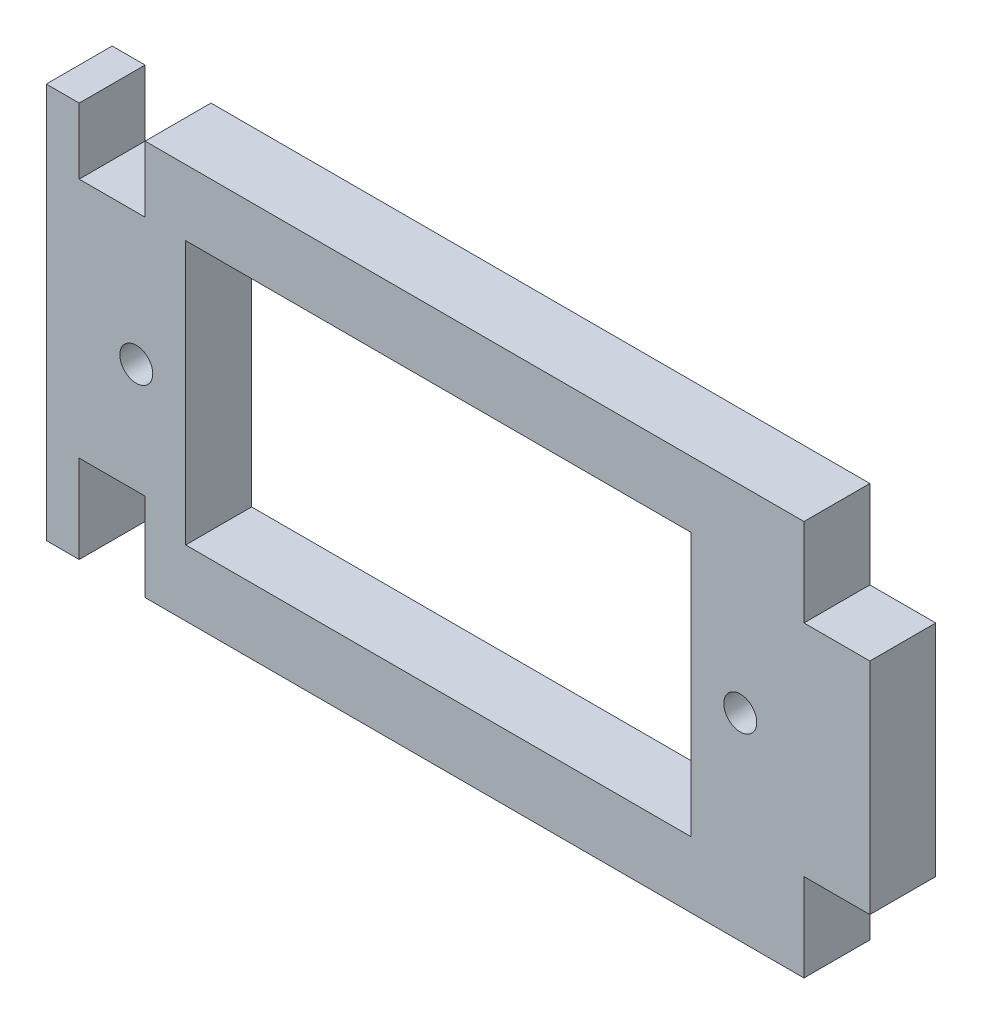
ISO-10303-21;
HEADER;
FILE_DESCRIPTION(('STEP AP214'),'2;1');
FILE_NAME('part.step','',(''),(''),'','','');
FILE_SCHEMA(('AUTOMOTIVE_DESIGN { 1 0 10303 214 1 1 1 1 }'));
ENDSEC;
DATA;
#1=APPLICATION_CONTEXT('core data for automotive mechanical design processes');
#2=APPLICATION_PROTOCOL_DEFINITION('international standard','automotive_design',2000,#1);
#3=PRODUCT_CONTEXT('',#1,'mechanical');
#4=PRODUCT('Part','Part','',(#3));
#5=PRODUCT_RELATED_PRODUCT_CATEGORY('part','',(#4));
#6=PRODUCT_DEFINITION_FORMATION('','',#4);
#7=PRODUCT_DEFINITION_CONTEXT('part definition',#1,'design');
#8=PRODUCT_DEFINITION('design','',#6,#7);
#9=PRODUCT_DEFINITION_SHAPE('','',#8);
#10=(LENGTH_UNIT() NAMED_UNIT(*) SI_UNIT(.MILLI.,.METRE.));
#11=(NAMED_UNIT(*) PLANE_ANGLE_UNIT() SI_UNIT($,.RADIAN.));
#12=(NAMED_UNIT(*) SI_UNIT($,.STERADIAN.) SOLID_ANGLE_UNIT());
#13=UNCERTAINTY_MEASURE_WITH_UNIT(LENGTH_MEASURE(1.E-05),#10,'distance_accuracy_value','');
#14=(GEOMETRIC_REPRESENTATION_CONTEXT(3) GLOBAL_UNCERTAINTY_ASSIGNED_CONTEXT((#13)) GLOBAL_UNIT_ASSIGNED_CONTEXT((#10,
#11,#12)) REPRESENTATION_CONTEXT('',''));
#15=CARTESIAN_POINT('',(0.,0.,0.));
#16=DIRECTION('',(0.,0.,1.));
#17=DIRECTION('',(1.,0.,0.));
#18=AXIS2_PLACEMENT_3D('',#15,#16,#17);
#19=CARTESIAN_POINT('',(0.,-15.,3.));
#20=DIRECTION('',(0.,-1.,0.));
#21=DIRECTION('',(0.,0.,-1.));
#22=AXIS2_PLACEMENT_3D('',#19,#20,#21);
#23=PLANE('',#22);
#24=DIRECTION('',(-1.,0.,0.));
#25=VECTOR('',#24,1.);
#26=CARTESIAN_POINT('',(0.,-15.,0.));
#27=LINE('',#26,#25);
#28=CARTESIAN_POINT('',(29.35,-15.,0.));
#29=VERTEX_POINT('',#28);
#30=CARTESIAN_POINT('',(6.35000000000001,-15.,0.));
#31=VERTEX_POINT('',#30);
#32=EDGE_CURVE('E260',#29,#31,#27,.T.);
#33=ORIENTED_EDGE('',*,*,#32,.T.);
#34=DIRECTION('',(0.,0.,-1.));
#35=VECTOR('',#34,1.);
#36=CARTESIAN_POINT('',(6.35000000000001,-15.,3.));
#37=LINE('',#36,#35);
#38=CARTESIAN_POINT('',(6.35000000000001,-15.,3.));
#39=VERTEX_POINT('',#38);
#40=EDGE_CURVE('E11',#39,#31,#37,.T.);
#41=ORIENTED_EDGE('',*,*,#40,.F.);
#42=DIRECTION('',(-1.,0.,0.));
#43=VECTOR('',#42,1.);
#44=CARTESIAN_POINT('',(0.,-15.,3.));
#45=LINE('',#44,#43);
#46=CARTESIAN_POINT('',(29.35,-15.,3.));
#47=VERTEX_POINT('',#46);
#48=EDGE_CURVE('E192',#47,#39,#45,.T.);
#49=ORIENTED_EDGE('',*,*,#48,.F.);
#50=DIRECTION('',(0.,0.,-1.));
#51=VECTOR('',#50,1.);
#52=CARTESIAN_POINT('',(29.35,-15.,3.));
#53=LINE('',#52,#51);
#54=EDGE_CURVE('E267',#47,#29,#53,.T.);
#55=ORIENTED_EDGE('',*,*,#54,.T.);
#56=EDGE_LOOP('',(#33,#41,#49,#55));
#57=FACE_BOUND('',#56,.T.);
#58=ADVANCED_FACE('F39',(#57),#23,.F.);
#59=CARTESIAN_POINT('',(6.35000000000001,0.,3.));
#60=DIRECTION('',(-1.,0.,0.));
#61=DIRECTION('',(0.,0.,1.));
#62=AXIS2_PLACEMENT_3D('',#59,#60,#61);
#63=PLANE('',#62);
#64=DIRECTION('',(0.,1.,0.));
#65=VECTOR('',#64,1.);
#66=CARTESIAN_POINT('',(6.35000000000001,0.,0.));
#67=LINE('',#66,#65);
#68=CARTESIAN_POINT('',(6.35,-3.,0.));
#69=VERTEX_POINT('',#68);
#70=EDGE_CURVE('E197',#31,#69,#67,.T.);
#71=ORIENTED_EDGE('',*,*,#70,.T.);
#72=DIRECTION('',(0.,0.,-1.));
#73=VECTOR('',#72,1.);
#74=CARTESIAN_POINT('',(6.35,-3.,3.));
#75=LINE('',#74,#73);
#76=CARTESIAN_POINT('',(6.35,-3.,3.));
#77=VERTEX_POINT('',#76);
#78=EDGE_CURVE('E49',#77,#69,#75,.T.);
#79=ORIENTED_EDGE('',*,*,#78,.F.);
#80=DIRECTION('',(0.,1.,0.));
#81=VECTOR('',#80,1.);
#82=CARTESIAN_POINT('',(6.35000000000001,0.,3.));
#83=LINE('',#82,#81);
#84=EDGE_CURVE('E186',#39,#77,#83,.T.);
#85=ORIENTED_EDGE('',*,*,#84,.F.);
#86=ORIENTED_EDGE('',*,*,#40,.T.);
#87=EDGE_LOOP('',(#71,#79,#85,#86));
#88=FACE_BOUND('',#87,.T.);
#89=ADVANCED_FACE('F196',(#88),#63,.F.);
#90=CARTESIAN_POINT('',(0.,-3.,3.));
#91=DIRECTION('',(0.,1.,0.));
#92=DIRECTION('',(0.,0.,1.));
#93=AXIS2_PLACEMENT_3D('',#90,#91,#92);
#94=PLANE('',#93);
#95=DIRECTION('',(1.,0.,0.));
#96=VECTOR('',#95,1.);
#97=CARTESIAN_POINT('',(0.,-3.,0.));
#98=LINE('',#97,#96);
#99=CARTESIAN_POINT('',(29.35,-3.,0.));
#100=VERTEX_POINT('',#99);
#101=EDGE_CURVE('E123',#69,#100,#98,.T.);
#102=ORIENTED_EDGE('',*,*,#101,.T.);
#103=DIRECTION('',(0.,0.,-1.));
#104=VECTOR('',#103,1.);
#105=CARTESIAN_POINT('',(29.35,-3.,3.));
#106=LINE('',#105,#104);
#107=CARTESIAN_POINT('',(29.35,-3.,3.));
#108=VERTEX_POINT('',#107);
#109=EDGE_CURVE('E198',#108,#100,#106,.T.);
#110=ORIENTED_EDGE('',*,*,#109,.F.);
#111=DIRECTION('',(1.,0.,0.));
#112=VECTOR('',#111,1.);
#113=CARTESIAN_POINT('',(0.,-3.,3.));
#114=LINE('',#113,#112);
#115=EDGE_CURVE('E190',#77,#108,#114,.T.);
#116=ORIENTED_EDGE('',*,*,#115,.F.);
#117=ORIENTED_EDGE('',*,*,#78,.T.);
#118=EDGE_LOOP('',(#102,#110,#116,#117));
#119=FACE_BOUND('',#118,.T.);
#120=ADVANCED_FACE('F200',(#119),#94,.F.);
#121=CARTESIAN_POINT('',(37.5,0.,3.));
#122=DIRECTION('',(1.,0.,0.));
#123=DIRECTION('',(0.,0.,-1.));
#124=AXIS2_PLACEMENT_3D('',#121,#122,#123);
#125=PLANE('',#124);
#126=DIRECTION('',(0.,-1.,0.));
#127=VECTOR('',#126,1.);
#128=CARTESIAN_POINT('',(37.5,0.,0.));
#129=LINE('',#128,#127);
#130=CARTESIAN_POINT('',(37.5,-4.,0.));
#131=VERTEX_POINT('',#130);
#132=CARTESIAN_POINT('',(37.5,-14.,0.));
#133=VERTEX_POINT('',#132);
#134=EDGE_CURVE('E212',#131,#133,#129,.T.);
#135=ORIENTED_EDGE('',*,*,#134,.F.);
#136=DIRECTION('',(0.,0.,-1.));
#137=VECTOR('',#136,1.);
#138=CARTESIAN_POINT('',(37.5,-4.,3.));
#139=LINE('',#138,#137);
#140=CARTESIAN_POINT('',(37.5,-4.,3.));
#141=VERTEX_POINT('',#140);
#142=EDGE_CURVE('E43',#141,#131,#139,.T.);
#143=ORIENTED_EDGE('',*,*,#142,.F.);
#144=DIRECTION('',(0.,-1.,0.));
#145=VECTOR('',#144,1.);
#146=CARTESIAN_POINT('',(37.5,0.,3.));
#147=LINE('',#146,#145);
#148=CARTESIAN_POINT('',(37.5,-14.,3.));
#149=VERTEX_POINT('',#148);
#150=EDGE_CURVE('E369',#141,#149,#147,.T.);
#151=ORIENTED_EDGE('',*,*,#150,.T.);
#152=DIRECTION('',(0.,0.,-1.));
#153=VECTOR('',#152,1.);
#154=CARTESIAN_POINT('',(37.5,-14.,3.));
#155=LINE('',#154,#153);
#156=EDGE_CURVE('E202',#149,#133,#155,.T.);
#157=ORIENTED_EDGE('',*,*,#156,.T.);
#158=EDGE_LOOP('',(#135,#143,#151,#157));
#159=FACE_BOUND('',#158,.T.);
#160=ADVANCED_FACE('F310',(#159),#125,.T.);
#161=CARTESIAN_POINT('',(0.,-4.,3.));
#162=DIRECTION('',(0.,1.,0.));
#163=DIRECTION('',(0.,0.,1.));
#164=AXIS2_PLACEMENT_3D('',#161,#162,#163);
#165=PLANE('',#164);
#166=DIRECTION('',(1.,0.,0.));
#167=VECTOR('',#166,1.);
#168=CARTESIAN_POINT('',(0.,-4.,0.));
#169=LINE('',#168,#167);
#170=CARTESIAN_POINT('',(34.5,-4.,0.));
#171=VERTEX_POINT('',#170);
#172=EDGE_CURVE('E215',#171,#131,#169,.T.);
#173=ORIENTED_EDGE('',*,*,#172,.F.);
#174=DIRECTION('',(0.,0.,-1.));
#175=VECTOR('',#174,1.);
#176=CARTESIAN_POINT('',(34.5,-4.,3.));
#177=LINE('',#176,#175);
#178=CARTESIAN_POINT('',(34.5,-4.,3.));
#179=VERTEX_POINT('',#178);
#180=EDGE_CURVE('E300',#179,#171,#177,.T.);
#181=ORIENTED_EDGE('',*,*,#180,.F.);
#182=DIRECTION('',(1.,0.,0.));
#183=VECTOR('',#182,1.);
#184=CARTESIAN_POINT('',(0.,-4.,3.));
#185=LINE('',#184,#183);
#186=EDGE_CURVE('E309',#179,#141,#185,.T.);
#187=ORIENTED_EDGE('',*,*,#186,.T.);
#188=ORIENTED_EDGE('',*,*,#142,.T.);
#189=EDGE_LOOP('',(#173,#181,#187,#188));
#190=FACE_BOUND('',#189,.T.);
#191=ADVANCED_FACE('F307',(#190),#165,.T.);
#192=CARTESIAN_POINT('',(34.5,0.,3.));
#193=DIRECTION('',(1.,0.,0.));
#194=DIRECTION('',(0.,0.,-1.));
#195=AXIS2_PLACEMENT_3D('',#192,#193,#194);
#196=PLANE('',#195);
#197=DIRECTION('',(0.,-1.,0.));
#198=VECTOR('',#197,1.);
#199=CARTESIAN_POINT('',(34.5,0.,0.));
#200=LINE('',#199,#198);
#201=CARTESIAN_POINT('',(34.5,0.,0.));
#202=VERTEX_POINT('',#201);
#203=EDGE_CURVE('E218',#202,#171,#200,.T.);
#204=ORIENTED_EDGE('',*,*,#203,.F.);
#205=DIRECTION('',(0.,0.,-1.));
#206=VECTOR('',#205,1.);
#207=CARTESIAN_POINT('',(34.5,0.,3.));
#208=LINE('',#207,#206);
#209=CARTESIAN_POINT('',(34.5,0.,3.));
#210=VERTEX_POINT('',#209);
#211=EDGE_CURVE('E299',#210,#202,#208,.T.);
#212=ORIENTED_EDGE('',*,*,#211,.F.);
#213=DIRECTION('',(0.,-1.,0.));
#214=VECTOR('',#213,1.);
#215=CARTESIAN_POINT('',(34.5,0.,3.));
#216=LINE('',#215,#214);
#217=EDGE_CURVE('E318',#210,#179,#216,.T.);
#218=ORIENTED_EDGE('',*,*,#217,.T.);
#219=ORIENTED_EDGE('',*,*,#180,.T.);
#220=EDGE_LOOP('',(#204,#212,#218,#219));
#221=FACE_BOUND('',#220,.T.);
#222=ADVANCED_FACE('F316',(#221),#196,.T.);
#223=CARTESIAN_POINT('',(0.,0.,3.));
#224=DIRECTION('',(0.,1.,0.));
#225=DIRECTION('',(0.,0.,1.));
#226=AXIS2_PLACEMENT_3D('',#223,#224,#225);
#227=PLANE('',#226);
#228=DIRECTION('',(1.,0.,0.));
#229=VECTOR('',#228,1.);
#230=CARTESIAN_POINT('',(0.,0.,0.));
#231=LINE('',#230,#229);
#232=CARTESIAN_POINT('',(4.5,0.,0.));
#233=VERTEX_POINT('',#232);
#234=EDGE_CURVE('E221',#233,#202,#231,.T.);
#235=ORIENTED_EDGE('',*,*,#234,.F.);
#236=DIRECTION('',(0.,0.,-1.));
#237=VECTOR('',#236,1.);
#238=CARTESIAN_POINT('',(4.5,0.,3.));
#239=LINE('',#238,#237);
#240=CARTESIAN_POINT('',(4.5,0.,3.));
#241=VERTEX_POINT('',#240);
#242=EDGE_CURVE('E297',#241,#233,#239,.T.);
#243=ORIENTED_EDGE('',*,*,#242,.F.);
#244=DIRECTION('',(1.,0.,0.));
#245=VECTOR('',#244,1.);
#246=CARTESIAN_POINT('',(0.,0.,3.));
#247=LINE('',#246,#245);
#248=EDGE_CURVE('E324',#241,#210,#247,.T.);
#249=ORIENTED_EDGE('',*,*,#248,.T.);
#250=ORIENTED_EDGE('',*,*,#211,.T.);
#251=EDGE_LOOP('',(#235,#243,#249,#250));
#252=FACE_BOUND('',#251,.T.);
#253=ADVANCED_FACE('F327',(#252),#227,.T.);
#254=CARTESIAN_POINT('',(4.5,0.,3.));
#255=DIRECTION('',(-1.,0.,0.));
#256=DIRECTION('',(0.,0.,1.));
#257=AXIS2_PLACEMENT_3D('',#254,#255,#256);
#258=PLANE('',#257);
#259=DIRECTION('',(0.,1.,0.));
#260=VECTOR('',#259,1.);
#261=CARTESIAN_POINT('',(4.5,0.,0.));
#262=LINE('',#261,#260);
#263=CARTESIAN_POINT('',(4.5,-3.,0.));
#264=VERTEX_POINT('',#263);
#265=EDGE_CURVE('E224',#264,#233,#262,.T.);
#266=ORIENTED_EDGE('',*,*,#265,.F.);
#267=DIRECTION('',(0.,0.,-1.));
#268=VECTOR('',#267,1.);
#269=CARTESIAN_POINT('',(4.5,-3.,3.));
#270=LINE('',#269,#268);
#271=CARTESIAN_POINT('',(4.5,-3.,3.));
#272=VERTEX_POINT('',#271);
#273=EDGE_CURVE('E295',#272,#264,#270,.T.);
#274=ORIENTED_EDGE('',*,*,#273,.F.);
#275=DIRECTION('',(0.,1.,0.));
#276=VECTOR('',#275,1.);
#277=CARTESIAN_POINT('',(4.5,0.,3.));
#278=LINE('',#277,#276);
#279=EDGE_CURVE('E328',#272,#241,#278,.T.);
#280=ORIENTED_EDGE('',*,*,#279,.T.);
#281=ORIENTED_EDGE('',*,*,#242,.T.);
#282=EDGE_LOOP('',(#266,#274,#280,#281));
#283=FACE_BOUND('',#282,.T.);
#284=ADVANCED_FACE('F407',(#283),#258,.T.);
#285=CARTESIAN_POINT('',(0.,-3.,3.));
#286=DIRECTION('',(0.,1.,0.));
#287=DIRECTION('',(0.,0.,1.));
#288=AXIS2_PLACEMENT_3D('',#285,#286,#287);
#289=PLANE('',#288);
#290=DIRECTION('',(1.,0.,0.));
#291=VECTOR('',#290,1.);
#292=CARTESIAN_POINT('',(0.,-3.,0.));
#293=LINE('',#292,#291);
#294=CARTESIAN_POINT('',(1.5,-3.,0.));
#295=VERTEX_POINT('',#294);
#296=EDGE_CURVE('E227',#295,#264,#293,.T.);
#297=ORIENTED_EDGE('',*,*,#296,.F.);
#298=DIRECTION('',(0.,0.,-1.));
#299=VECTOR('',#298,1.);
#300=CARTESIAN_POINT('',(1.5,-3.,3.));
#301=LINE('',#300,#299);
#302=CARTESIAN_POINT('',(1.5,-3.,3.));
#303=VERTEX_POINT('',#302);
#304=EDGE_CURVE('E293',#303,#295,#301,.T.);
#305=ORIENTED_EDGE('',*,*,#304,.F.);
#306=DIRECTION('',(1.,0.,0.));
#307=VECTOR('',#306,1.);
#308=CARTESIAN_POINT('',(0.,-3.,3.));
#309=LINE('',#308,#307);
#310=EDGE_CURVE('E330',#303,#272,#309,.T.);
#311=ORIENTED_EDGE('',*,*,#310,.T.);
#312=ORIENTED_EDGE('',*,*,#273,.T.);
#313=EDGE_LOOP('',(#297,#305,#311,#312));
#314=FACE_BOUND('',#313,.T.);
#315=ADVANCED_FACE('F404',(#314),#289,.T.);
#316=CARTESIAN_POINT('',(1.5,0.,3.));
#317=DIRECTION('',(1.,0.,0.));
#318=DIRECTION('',(0.,0.,-1.));
#319=AXIS2_PLACEMENT_3D('',#316,#317,#318);
#320=PLANE('',#319);
#321=DIRECTION('',(0.,-1.,0.));
#322=VECTOR('',#321,1.);
#323=CARTESIAN_POINT('',(1.5,0.,0.));
#324=LINE('',#323,#322);
#325=CARTESIAN_POINT('',(1.5,0.,0.));
#326=VERTEX_POINT('',#325);
#327=EDGE_CURVE('E230',#326,#295,#324,.T.);
#328=ORIENTED_EDGE('',*,*,#327,.F.);
#329=DIRECTION('',(0.,0.,-1.));
#330=VECTOR('',#329,1.);
#331=CARTESIAN_POINT('',(1.5,0.,3.));
#332=LINE('',#331,#330);
#333=CARTESIAN_POINT('',(1.5,0.,3.));
#334=VERTEX_POINT('',#333);
#335=EDGE_CURVE('E291',#334,#326,#332,.T.);
#336=ORIENTED_EDGE('',*,*,#335,.F.);
#337=DIRECTION('',(0.,-1.,0.));
#338=VECTOR('',#337,1.);
#339=CARTESIAN_POINT('',(1.5,0.,3.));
#340=LINE('',#339,#338);
#341=EDGE_CURVE('E336',#334,#303,#340,.T.);
#342=ORIENTED_EDGE('',*,*,#341,.T.);
#343=ORIENTED_EDGE('',*,*,#304,.T.);
#344=EDGE_LOOP('',(#328,#336,#342,#343));
#345=FACE_BOUND('',#344,.T.);
#346=ADVANCED_FACE('F400',(#345),#320,.T.);
#347=CARTESIAN_POINT('',(0.,0.,3.));
#348=DIRECTION('',(0.,1.,0.));
#349=DIRECTION('',(0.,0.,1.));
#350=AXIS2_PLACEMENT_3D('',#347,#348,#349);
#351=PLANE('',#350);
#352=DIRECTION('',(1.,0.,0.));
#353=VECTOR('',#352,1.);
#354=CARTESIAN_POINT('',(0.,0.,0.));
#355=LINE('',#354,#353);
#356=CARTESIAN_POINT('',(0.,0.,0.));
#357=VERTEX_POINT('',#356);
#358=EDGE_CURVE('E233',#357,#326,#355,.T.);
#359=ORIENTED_EDGE('',*,*,#358,.F.);
#360=DIRECTION('',(0.,0.,-1.));
#361=VECTOR('',#360,1.);
#362=CARTESIAN_POINT('',(0.,0.,3.));
#363=LINE('',#362,#361);
#364=CARTESIAN_POINT('',(0.,0.,3.));
#365=VERTEX_POINT('',#364);
#366=EDGE_CURVE('E289',#365,#357,#363,.T.);
#367=ORIENTED_EDGE('',*,*,#366,.F.);
#368=DIRECTION('',(1.,0.,0.));
#369=VECTOR('',#368,1.);
#370=CARTESIAN_POINT('',(0.,0.,3.));
#371=LINE('',#370,#369);
#372=EDGE_CURVE('E339',#365,#334,#371,.T.);
#373=ORIENTED_EDGE('',*,*,#372,.T.);
#374=ORIENTED_EDGE('',*,*,#335,.T.);
#375=EDGE_LOOP('',(#359,#367,#373,#374));
#376=FACE_BOUND('',#375,.T.);
#377=ADVANCED_FACE('F395',(#376),#351,.T.);
#378=CARTESIAN_POINT('',(0.,0.,3.));
#379=DIRECTION('',(1.,0.,0.));
#380=DIRECTION('',(0.,0.,-1.));
#381=AXIS2_PLACEMENT_3D('',#378,#379,#380);
#382=PLANE('',#381);
#383=DIRECTION('',(0.,-1.,0.));
#384=VECTOR('',#383,1.);
#385=CARTESIAN_POINT('',(0.,0.,0.));
#386=LINE('',#385,#384);
#387=CARTESIAN_POINT('',(0.,-18.,0.));
#388=VERTEX_POINT('',#387);
#389=EDGE_CURVE('E236',#357,#388,#386,.T.);
#390=ORIENTED_EDGE('',*,*,#389,.T.);
#391=DIRECTION('',(0.,0.,-1.));
#392=VECTOR('',#391,1.);
#393=CARTESIAN_POINT('',(0.,-18.,3.));
#394=LINE('',#393,#392);
#395=CARTESIAN_POINT('',(0.,-18.,3.));
#396=VERTEX_POINT('',#395);
#397=EDGE_CURVE('E286',#396,#388,#394,.T.);
#398=ORIENTED_EDGE('',*,*,#397,.F.);
#399=DIRECTION('',(0.,-1.,0.));
#400=VECTOR('',#399,1.);
#401=CARTESIAN_POINT('',(0.,0.,3.));
#402=LINE('',#401,#400);
#403=EDGE_CURVE('E342',#365,#396,#402,.T.);
#404=ORIENTED_EDGE('',*,*,#403,.F.);
#405=ORIENTED_EDGE('',*,*,#366,.T.);
#406=EDGE_LOOP('',(#390,#398,#404,#405));
#407=FACE_BOUND('',#406,.T.);
#408=ADVANCED_FACE('F392',(#407),#382,.F.);
#409=CARTESIAN_POINT('',(0.,-18.,3.));
#410=DIRECTION('',(0.,1.,0.));
#411=DIRECTION('',(0.,0.,1.));
#412=AXIS2_PLACEMENT_3D('',#409,#410,#411);
#413=PLANE('',#412);
#414=DIRECTION('',(1.,0.,0.));
#415=VECTOR('',#414,1.);
#416=CARTESIAN_POINT('',(0.,-18.,0.));
#417=LINE('',#416,#415);
#418=CARTESIAN_POINT('',(1.5,-18.,0.));
#419=VERTEX_POINT('',#418);
#420=EDGE_CURVE('E239',#388,#419,#417,.T.);
#421=ORIENTED_EDGE('',*,*,#420,.T.);
#422=DIRECTION('',(0.,0.,-1.));
#423=VECTOR('',#422,1.);
#424=CARTESIAN_POINT('',(1.5,-18.,3.));
#425=LINE('',#424,#423);
#426=CARTESIAN_POINT('',(1.5,-18.,3.));
#427=VERTEX_POINT('',#426);
#428=EDGE_CURVE('E283',#427,#419,#425,.T.);
#429=ORIENTED_EDGE('',*,*,#428,.F.);
#430=DIRECTION('',(1.,0.,0.));
#431=VECTOR('',#430,1.);
#432=CARTESIAN_POINT('',(0.,-18.,3.));
#433=LINE('',#432,#431);
#434=EDGE_CURVE('E345',#396,#427,#433,.T.);
#435=ORIENTED_EDGE('',*,*,#434,.F.);
#436=ORIENTED_EDGE('',*,*,#397,.T.);
#437=EDGE_LOOP('',(#421,#429,#435,#436));
#438=FACE_BOUND('',#437,.T.);
#439=ADVANCED_FACE('F388',(#438),#413,.F.);
#440=CARTESIAN_POINT('',(1.5,0.,3.));
#441=DIRECTION('',(-1.,0.,0.));
#442=DIRECTION('',(0.,0.,1.));
#443=AXIS2_PLACEMENT_3D('',#440,#441,#442);
#444=PLANE('',#443);
#445=DIRECTION('',(0.,1.,0.));
#446=VECTOR('',#445,1.);
#447=CARTESIAN_POINT('',(1.5,0.,0.));
#448=LINE('',#447,#446);
#449=CARTESIAN_POINT('',(1.5,-14.,0.));
#450=VERTEX_POINT('',#449);
#451=EDGE_CURVE('E242',#419,#450,#448,.T.);
#452=ORIENTED_EDGE('',*,*,#451,.T.);
#453=DIRECTION('',(0.,0.,-1.));
#454=VECTOR('',#453,1.);
#455=CARTESIAN_POINT('',(1.5,-14.,3.));
#456=LINE('',#455,#454);
#457=CARTESIAN_POINT('',(1.5,-14.,3.));
#458=VERTEX_POINT('',#457);
#459=EDGE_CURVE('E280',#458,#450,#456,.T.);
#460=ORIENTED_EDGE('',*,*,#459,.F.);
#461=DIRECTION('',(0.,1.,0.));
#462=VECTOR('',#461,1.);
#463=CARTESIAN_POINT('',(1.5,0.,3.));
#464=LINE('',#463,#462);
#465=EDGE_CURVE('E348',#427,#458,#464,.T.);
#466=ORIENTED_EDGE('',*,*,#465,.F.);
#467=ORIENTED_EDGE('',*,*,#428,.T.);
#468=EDGE_LOOP('',(#452,#460,#466,#467));
#469=FACE_BOUND('',#468,.T.);
#470=ADVANCED_FACE('F386',(#469),#444,.F.);
#471=CARTESIAN_POINT('',(0.,-14.,3.));
#472=DIRECTION('',(0.,1.,0.));
#473=DIRECTION('',(0.,0.,1.));
#474=AXIS2_PLACEMENT_3D('',#471,#472,#473);
#475=PLANE('',#474);
#476=DIRECTION('',(1.,0.,0.));
#477=VECTOR('',#476,1.);
#478=CARTESIAN_POINT('',(0.,-14.,0.));
#479=LINE('',#478,#477);
#480=CARTESIAN_POINT('',(4.5,-14.,0.));
#481=VERTEX_POINT('',#480);
#482=EDGE_CURVE('E245',#450,#481,#479,.T.);
#483=ORIENTED_EDGE('',*,*,#482,.T.);
#484=DIRECTION('',(0.,0.,-1.));
#485=VECTOR('',#484,1.);
#486=CARTESIAN_POINT('',(4.5,-14.,3.));
#487=LINE('',#486,#485);
#488=CARTESIAN_POINT('',(4.5,-14.,3.));
#489=VERTEX_POINT('',#488);
#490=EDGE_CURVE('E277',#489,#481,#487,.T.);
#491=ORIENTED_EDGE('',*,*,#490,.F.);
#492=DIRECTION('',(1.,0.,0.));
#493=VECTOR('',#492,1.);
#494=CARTESIAN_POINT('',(0.,-14.,3.));
#495=LINE('',#494,#493);
#496=EDGE_CURVE('E351',#458,#489,#495,.T.);
#497=ORIENTED_EDGE('',*,*,#496,.F.);
#498=ORIENTED_EDGE('',*,*,#459,.T.);
#499=EDGE_LOOP('',(#483,#491,#497,#498));
#500=FACE_BOUND('',#499,.T.);
#501=ADVANCED_FACE('F381',(#500),#475,.F.);
#502=CARTESIAN_POINT('',(4.5,0.,3.));
#503=DIRECTION('',(1.,0.,0.));
#504=DIRECTION('',(0.,0.,-1.));
#505=AXIS2_PLACEMENT_3D('',#502,#503,#504);
#506=PLANE('',#505);
#507=DIRECTION('',(0.,-1.,0.));
#508=VECTOR('',#507,1.);
#509=CARTESIAN_POINT('',(4.5,0.,0.));
#510=LINE('',#509,#508);
#511=CARTESIAN_POINT('',(4.5,-18.,0.));
#512=VERTEX_POINT('',#511);
#513=EDGE_CURVE('E248',#481,#512,#510,.T.);
#514=ORIENTED_EDGE('',*,*,#513,.T.);
#515=DIRECTION('',(0.,0.,-1.));
#516=VECTOR('',#515,1.);
#517=CARTESIAN_POINT('',(4.5,-18.,3.));
#518=LINE('',#517,#516);
#519=CARTESIAN_POINT('',(4.5,-18.,3.));
#520=VERTEX_POINT('',#519);
#521=EDGE_CURVE('E275',#520,#512,#518,.T.);
#522=ORIENTED_EDGE('',*,*,#521,.F.);
#523=DIRECTION('',(0.,-1.,0.));
#524=VECTOR('',#523,1.);
#525=CARTESIAN_POINT('',(4.5,0.,3.));
#526=LINE('',#525,#524);
#527=EDGE_CURVE('E354',#489,#520,#526,.T.);
#528=ORIENTED_EDGE('',*,*,#527,.F.);
#529=ORIENTED_EDGE('',*,*,#490,.T.);
#530=EDGE_LOOP('',(#514,#522,#528,#529));
#531=FACE_BOUND('',#530,.T.);
#532=ADVANCED_FACE('F378',(#531),#506,.F.);
#533=CARTESIAN_POINT('',(0.,-18.,3.));
#534=DIRECTION('',(0.,-1.,0.));
#535=DIRECTION('',(0.,0.,-1.));
#536=AXIS2_PLACEMENT_3D('',#533,#534,#535);
#537=PLANE('',#536);
#538=DIRECTION('',(-1.,0.,0.));
#539=VECTOR('',#538,1.);
#540=CARTESIAN_POINT('',(0.,-18.,0.));
#541=LINE('',#540,#539);
#542=CARTESIAN_POINT('',(34.5,-18.,0.));
#543=VERTEX_POINT('',#542);
#544=EDGE_CURVE('E251',#543,#512,#541,.T.);
#545=ORIENTED_EDGE('',*,*,#544,.F.);
#546=DIRECTION('',(0.,0.,-1.));
#547=VECTOR('',#546,1.);
#548=CARTESIAN_POINT('',(34.5,-18.,3.));
#549=LINE('',#548,#547);
#550=CARTESIAN_POINT('',(34.5,-18.,3.));
#551=VERTEX_POINT('',#550);
#552=EDGE_CURVE('E273',#551,#543,#549,.T.);
#553=ORIENTED_EDGE('',*,*,#552,.F.);
#554=DIRECTION('',(-1.,0.,0.));
#555=VECTOR('',#554,1.);
#556=CARTESIAN_POINT('',(0.,-18.,3.));
#557=LINE('',#556,#555);
#558=EDGE_CURVE('E356',#551,#520,#557,.T.);
#559=ORIENTED_EDGE('',*,*,#558,.T.);
#560=ORIENTED_EDGE('',*,*,#521,.T.);
#561=EDGE_LOOP('',(#545,#553,#559,#560));
#562=FACE_BOUND('',#561,.T.);
#563=ADVANCED_FACE('F375',(#562),#537,.T.);
#564=CARTESIAN_POINT('',(34.5,0.,3.));
#565=DIRECTION('',(1.,0.,0.));
#566=DIRECTION('',(0.,0.,-1.));
#567=AXIS2_PLACEMENT_3D('',#564,#565,#566);
#568=PLANE('',#567);
#569=DIRECTION('',(0.,-1.,0.));
#570=VECTOR('',#569,1.);
#571=CARTESIAN_POINT('',(34.5,0.,0.));
#572=LINE('',#571,#570);
#573=CARTESIAN_POINT('',(34.5,-14.,0.));
#574=VERTEX_POINT('',#573);
#575=EDGE_CURVE('E254',#574,#543,#572,.T.);
#576=ORIENTED_EDGE('',*,*,#575,.F.);
#577=DIRECTION('',(0.,0.,-1.));
#578=VECTOR('',#577,1.);
#579=CARTESIAN_POINT('',(34.5,-14.,3.));
#580=LINE('',#579,#578);
#581=CARTESIAN_POINT('',(34.5,-14.,3.));
#582=VERTEX_POINT('',#581);
#583=EDGE_CURVE('E271',#582,#574,#580,.T.);
#584=ORIENTED_EDGE('',*,*,#583,.F.);
#585=DIRECTION('',(0.,-1.,0.));
#586=VECTOR('',#585,1.);
#587=CARTESIAN_POINT('',(34.5,0.,3.));
#588=LINE('',#587,#586);
#589=EDGE_CURVE('E359',#582,#551,#588,.T.);
#590=ORIENTED_EDGE('',*,*,#589,.T.);
#591=ORIENTED_EDGE('',*,*,#552,.T.);
#592=EDGE_LOOP('',(#576,#584,#590,#591));
#593=FACE_BOUND('',#592,.T.);
#594=ADVANCED_FACE('F372',(#593),#568,.T.);
#595=CARTESIAN_POINT('',(0.,-14.,3.));
#596=DIRECTION('',(0.,-1.,0.));
#597=DIRECTION('',(0.,0.,-1.));
#598=AXIS2_PLACEMENT_3D('',#595,#596,#597);
#599=PLANE('',#598);
#600=DIRECTION('',(-1.,0.,0.));
#601=VECTOR('',#600,1.);
#602=CARTESIAN_POINT('',(0.,-14.,0.));
#603=LINE('',#602,#601);
#604=EDGE_CURVE('E257',#133,#574,#603,.T.);
#605=ORIENTED_EDGE('',*,*,#604,.F.);
#606=ORIENTED_EDGE('',*,*,#156,.F.);
#607=DIRECTION('',(-1.,0.,0.));
#608=VECTOR('',#607,1.);
#609=CARTESIAN_POINT('',(0.,-14.,3.));
#610=LINE('',#609,#608);
#611=EDGE_CURVE('E362',#149,#582,#610,.T.);
#612=ORIENTED_EDGE('',*,*,#611,.T.);
#613=ORIENTED_EDGE('',*,*,#583,.T.);
#614=EDGE_LOOP('',(#605,#606,#612,#613));
#615=FACE_BOUND('',#614,.T.);
#616=ADVANCED_FACE('F366',(#615),#599,.T.);
#617=CARTESIAN_POINT('',(31.6,-9.,3.));
#618=DIRECTION('',(0.,0.,-1.));
#619=DIRECTION('',(-1.,0.,0.));
#620=AXIS2_PLACEMENT_3D('',#617,#618,#619);
#621=CYLINDRICAL_SURFACE('',#620,0.749999999999999);
#622=CARTESIAN_POINT('',(31.6,-9.,3.));
#623=DIRECTION('',(0.,0.,1.));
#624=DIRECTION('',(1.,0.,0.));
#625=AXIS2_PLACEMENT_3D('',#622,#623,#624);
#626=CIRCLE('',#625,0.749999999999999);
#627=CARTESIAN_POINT('',(32.35,-9.,3.));
#628=VERTEX_POINT('',#627);
#629=EDGE_CURVE('E666',#628,#628,#626,.T.);
#630=ORIENTED_EDGE('',*,*,#629,.T.);
#631=EDGE_LOOP('',(#630));
#632=FACE_BOUND('',#631,.T.);
#633=CARTESIAN_POINT('',(31.6,-9.,0.));
#634=DIRECTION('',(0.,0.,1.));
#635=DIRECTION('',(1.,0.,0.));
#636=AXIS2_PLACEMENT_3D('',#633,#634,#635);
#637=CIRCLE('',#636,0.749999999999999);
#638=CARTESIAN_POINT('',(32.35,-9.,0.));
#639=VERTEX_POINT('',#638);
#640=EDGE_CURVE('E209',#639,#639,#637,.T.);
#641=ORIENTED_EDGE('',*,*,#640,.F.);
#642=EDGE_LOOP('',(#641));
#643=FACE_BOUND('',#642,.T.);
#644=ADVANCED_FACE('F427',(#632,#643),#621,.F.);
#645=CARTESIAN_POINT('',(4.1,-9.00000000000001,3.));
#646=DIRECTION('',(0.,0.,-1.));
#647=DIRECTION('',(-1.,0.,0.));
#648=AXIS2_PLACEMENT_3D('',#645,#646,#647);
#649=CYLINDRICAL_SURFACE('',#648,0.75);
#650=CARTESIAN_POINT('',(4.1,-9.00000000000001,3.));
#651=DIRECTION('',(0.,0.,1.));
#652=DIRECTION('',(1.,0.,0.));
#653=AXIS2_PLACEMENT_3D('',#650,#651,#652);
#654=CIRCLE('',#653,0.75);
#655=CARTESIAN_POINT('',(4.85,-9.00000000000001,3.));
#656=VERTEX_POINT('',#655);
#657=EDGE_CURVE('E266',#656,#656,#654,.T.);
#658=ORIENTED_EDGE('',*,*,#657,.T.);
#659=EDGE_LOOP('',(#658));
#660=FACE_BOUND('',#659,.T.);
#661=CARTESIAN_POINT('',(4.1,-9.00000000000001,0.));
#662=DIRECTION('',(0.,0.,1.));
#663=DIRECTION('',(1.,0.,0.));
#664=AXIS2_PLACEMENT_3D('',#661,#662,#663);
#665=CIRCLE('',#664,0.75);
#666=CARTESIAN_POINT('',(4.85,-9.00000000000001,0.));
#667=VERTEX_POINT('',#666);
#668=EDGE_CURVE('E206',#667,#667,#665,.T.);
#669=ORIENTED_EDGE('',*,*,#668,.F.);
#670=EDGE_LOOP('',(#669));
#671=FACE_BOUND('',#670,.T.);
#672=ADVANCED_FACE('F41',(#660,#671),#649,.F.);
#673=CARTESIAN_POINT('',(29.35,0.,3.));
#674=DIRECTION('',(1.,0.,0.));
#675=DIRECTION('',(0.,0.,-1.));
#676=AXIS2_PLACEMENT_3D('',#673,#674,#675);
#677=PLANE('',#676);
#678=DIRECTION('',(0.,-1.,0.));
#679=VECTOR('',#678,1.);
#680=CARTESIAN_POINT('',(29.35,0.,0.));
#681=LINE('',#680,#679);
#682=EDGE_CURVE('E129',#100,#29,#681,.T.);
#683=ORIENTED_EDGE('',*,*,#682,.T.);
#684=ORIENTED_EDGE('',*,*,#54,.F.);
#685=DIRECTION('',(0.,-1.,0.));
#686=VECTOR('',#685,1.);
#687=CARTESIAN_POINT('',(29.35,0.,3.));
#688=LINE('',#687,#686);
#689=EDGE_CURVE('E58',#108,#47,#688,.T.);
#690=ORIENTED_EDGE('',*,*,#689,.F.);
#691=ORIENTED_EDGE('',*,*,#109,.T.);
#692=EDGE_LOOP('',(#683,#684,#690,#691));
#693=FACE_BOUND('',#692,.T.);
#694=ADVANCED_FACE('F497',(#693),#677,.F.);
#695=CARTESIAN_POINT('',(0.,0.,3.));
#696=DIRECTION('',(0.,0.,1.));
#697=DIRECTION('',(1.,0.,0.));
#698=AXIS2_PLACEMENT_3D('',#695,#696,#697);
#699=PLANE('',#698);
#700=ORIENTED_EDGE('',*,*,#657,.F.);
#701=EDGE_LOOP('',(#700));
#702=FACE_BOUND('',#701,.T.);
#703=ORIENTED_EDGE('',*,*,#629,.F.);
#704=EDGE_LOOP('',(#703));
#705=FACE_BOUND('',#704,.T.);
#706=ORIENTED_EDGE('',*,*,#150,.F.);
#707=ORIENTED_EDGE('',*,*,#186,.F.);
#708=ORIENTED_EDGE('',*,*,#217,.F.);
#709=ORIENTED_EDGE('',*,*,#248,.F.);
#710=ORIENTED_EDGE('',*,*,#279,.F.);
#711=ORIENTED_EDGE('',*,*,#310,.F.);
#712=ORIENTED_EDGE('',*,*,#341,.F.);
#713=ORIENTED_EDGE('',*,*,#372,.F.);
#714=ORIENTED_EDGE('',*,*,#403,.T.);
#715=ORIENTED_EDGE('',*,*,#434,.T.);
#716=ORIENTED_EDGE('',*,*,#465,.T.);
#717=ORIENTED_EDGE('',*,*,#496,.T.);
#718=ORIENTED_EDGE('',*,*,#527,.T.);
#719=ORIENTED_EDGE('',*,*,#558,.F.);
#720=ORIENTED_EDGE('',*,*,#589,.F.);
#721=ORIENTED_EDGE('',*,*,#611,.F.);
#722=EDGE_LOOP('',(#706,#707,#708,#709,#710,#711,#712,#713,#714,#715,#716,#717,#718,#719,#720,#721));
#723=FACE_BOUND('',#722,.T.);
#724=ORIENTED_EDGE('',*,*,#48,.T.);
#725=ORIENTED_EDGE('',*,*,#84,.T.);
#726=ORIENTED_EDGE('',*,*,#115,.T.);
#727=ORIENTED_EDGE('',*,*,#689,.T.);
#728=EDGE_LOOP('',(#724,#725,#726,#727));
#729=FACE_BOUND('',#728,.T.);
#730=ADVANCED_FACE('F188',(#702,#705,#723,#729),#699,.T.);
#731=CARTESIAN_POINT('',(0.,0.,0.));
#732=DIRECTION('',(0.,0.,1.));
#733=DIRECTION('',(1.,0.,0.));
#734=AXIS2_PLACEMENT_3D('',#731,#732,#733);
#735=PLANE('',#734);
#736=ORIENTED_EDGE('',*,*,#668,.T.);
#737=EDGE_LOOP('',(#736));
#738=FACE_BOUND('',#737,.T.);
#739=ORIENTED_EDGE('',*,*,#640,.T.);
#740=EDGE_LOOP('',(#739));
#741=FACE_BOUND('',#740,.T.);
#742=ORIENTED_EDGE('',*,*,#134,.T.);
#743=ORIENTED_EDGE('',*,*,#604,.T.);
#744=ORIENTED_EDGE('',*,*,#575,.T.);
#745=ORIENTED_EDGE('',*,*,#544,.T.);
#746=ORIENTED_EDGE('',*,*,#513,.F.);
#747=ORIENTED_EDGE('',*,*,#482,.F.);
#748=ORIENTED_EDGE('',*,*,#451,.F.);
#749=ORIENTED_EDGE('',*,*,#420,.F.);
#750=ORIENTED_EDGE('',*,*,#389,.F.);
#751=ORIENTED_EDGE('',*,*,#358,.T.);
#752=ORIENTED_EDGE('',*,*,#327,.T.);
#753=ORIENTED_EDGE('',*,*,#296,.T.);
#754=ORIENTED_EDGE('',*,*,#265,.T.);
#755=ORIENTED_EDGE('',*,*,#234,.T.);
#756=ORIENTED_EDGE('',*,*,#203,.T.);
#757=ORIENTED_EDGE('',*,*,#172,.T.);
#758=EDGE_LOOP('',(#742,#743,#744,#745,#746,#747,#748,#749,#750,#751,#752,#753,#754,#755,#756,#757));
#759=FACE_BOUND('',#758,.T.);
#760=ORIENTED_EDGE('',*,*,#32,.F.);
#761=ORIENTED_EDGE('',*,*,#682,.F.);
#762=ORIENTED_EDGE('',*,*,#101,.F.);
#763=ORIENTED_EDGE('',*,*,#70,.F.);
#764=EDGE_LOOP('',(#760,#761,#762,#763));
#765=FACE_BOUND('',#764,.T.);
#766=ADVANCED_FACE('F313',(#738,#741,#759,#765),#735,.F.);
#767=CLOSED_SHELL('',(#58,#89,#120,#160,#191,#222,#253,#284,#315,#346,#377,#408,#439,#470,#501,
#532,#563,#594,#616,#644,#672,#694,#730,#766));
#768=MANIFOLD_SOLID_BREP('B2',#767);
#769=ADVANCED_BREP_SHAPE_REPRESENTATION('',(#18,#768),#14);
#770=SHAPE_DEFINITION_REPRESENTATION(#9,#769);
ENDSEC;
END-ISO-10303-21;
